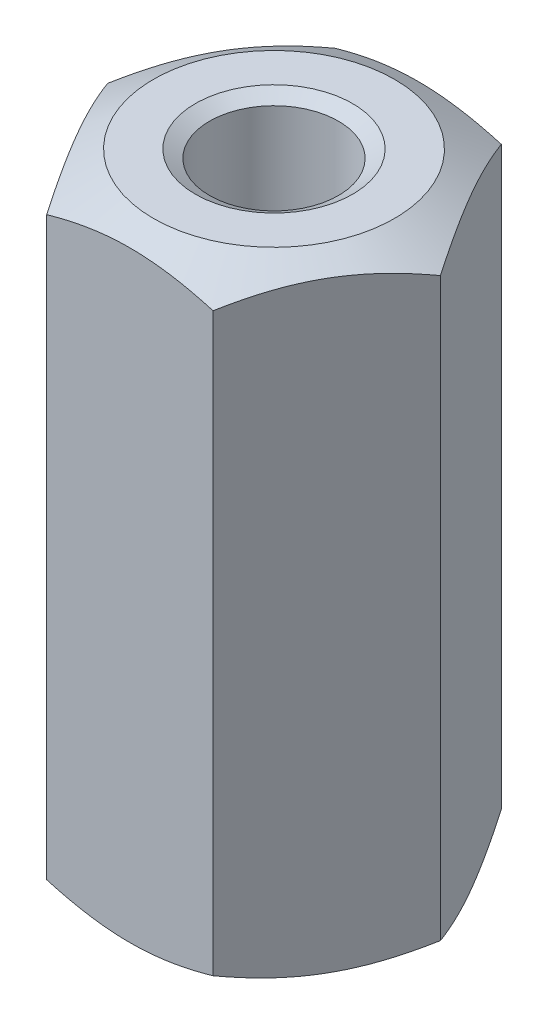
ISO-10303-21;
HEADER;
FILE_DESCRIPTION(('STEP AP214'),'2;1');
FILE_NAME('part.step','',(''),(''),'','','');
FILE_SCHEMA(('AUTOMOTIVE_DESIGN { 1 0 10303 214 1 1 1 1 }'));
ENDSEC;
DATA;
#1=APPLICATION_CONTEXT('core data for automotive mechanical design processes');
#2=APPLICATION_PROTOCOL_DEFINITION('international standard','automotive_design',2000,#1);
#3=PRODUCT_CONTEXT('',#1,'mechanical');
#4=PRODUCT('Part','Part','',(#3));
#5=PRODUCT_RELATED_PRODUCT_CATEGORY('part','',(#4));
#6=PRODUCT_DEFINITION_FORMATION('','',#4);
#7=PRODUCT_DEFINITION_CONTEXT('part definition',#1,'design');
#8=PRODUCT_DEFINITION('design','',#6,#7);
#9=PRODUCT_DEFINITION_SHAPE('','',#8);
#10=(LENGTH_UNIT() NAMED_UNIT(*) SI_UNIT(.MILLI.,.METRE.));
#11=(NAMED_UNIT(*) PLANE_ANGLE_UNIT() SI_UNIT($,.RADIAN.));
#12=(NAMED_UNIT(*) SI_UNIT($,.STERADIAN.) SOLID_ANGLE_UNIT());
#13=UNCERTAINTY_MEASURE_WITH_UNIT(LENGTH_MEASURE(1.E-05),#10,'distance_accuracy_value','');
#14=(GEOMETRIC_REPRESENTATION_CONTEXT(3) GLOBAL_UNCERTAINTY_ASSIGNED_CONTEXT((#13)) GLOBAL_UNIT_ASSIGNED_CONTEXT((#10,
#11,#12)) REPRESENTATION_CONTEXT('',''));
#15=CARTESIAN_POINT('',(0.,0.,0.));
#16=DIRECTION('',(0.,0.,1.));
#17=DIRECTION('',(1.,0.,0.));
#18=AXIS2_PLACEMENT_3D('',#15,#16,#17);
#19=CARTESIAN_POINT('',(0.,6.,0.));
#20=DIRECTION('',(0.,1.,0.));
#21=DIRECTION('',(0.,0.,1.));
#22=AXIS2_PLACEMENT_3D('',#19,#20,#21);
#23=PLANE('',#22);
#24=CARTESIAN_POINT('',(0.,6.,0.));
#25=DIRECTION('',(0.,1.,0.));
#26=DIRECTION('',(0.,0.,1.));
#27=AXIS2_PLACEMENT_3D('',#24,#25,#26);
#28=CIRCLE('',#27,2.3);
#29=CARTESIAN_POINT('',(0.,6.,2.3));
#30=VERTEX_POINT('',#29);
#31=EDGE_CURVE('E228',#30,#30,#28,.T.);
#32=ORIENTED_EDGE('',*,*,#31,.T.);
#33=EDGE_LOOP('',(#32));
#34=FACE_BOUND('',#33,.T.);
#35=CARTESIAN_POINT('',(0.,6.,0.));
#36=DIRECTION('',(0.,1.,0.));
#37=DIRECTION('',(0.,0.,1.));
#38=AXIS2_PLACEMENT_3D('',#35,#36,#37);
#39=CIRCLE('',#38,1.5);
#40=CARTESIAN_POINT('',(0.,6.,1.5));
#41=VERTEX_POINT('',#40);
#42=EDGE_CURVE('E125',#41,#41,#39,.F.);
#43=ORIENTED_EDGE('',*,*,#42,.T.);
#44=EDGE_LOOP('',(#43));
#45=FACE_BOUND('',#44,.T.);
#46=ADVANCED_FACE('F33',(#34,#45),#23,.T.);
#47=CARTESIAN_POINT('',(0.,-6.,0.));
#48=DIRECTION('',(0.,1.,0.));
#49=DIRECTION('',(0.,0.,1.));
#50=AXIS2_PLACEMENT_3D('',#47,#48,#49);
#51=PLANE('',#50);
#52=CARTESIAN_POINT('',(0.,-6.,0.));
#53=DIRECTION('',(0.,1.,0.));
#54=DIRECTION('',(0.,0.,1.));
#55=AXIS2_PLACEMENT_3D('',#52,#53,#54);
#56=CIRCLE('',#55,2.3);
#57=CARTESIAN_POINT('',(0.,-6.,2.3));
#58=VERTEX_POINT('',#57);
#59=EDGE_CURVE('E103',#58,#58,#56,.T.);
#60=ORIENTED_EDGE('',*,*,#59,.F.);
#61=EDGE_LOOP('',(#60));
#62=FACE_BOUND('',#61,.T.);
#63=CARTESIAN_POINT('',(0.,-6.,0.));
#64=DIRECTION('',(0.,1.,0.));
#65=DIRECTION('',(0.,0.,1.));
#66=AXIS2_PLACEMENT_3D('',#63,#64,#65);
#67=CIRCLE('',#66,1.5);
#68=CARTESIAN_POINT('',(0.,-6.,1.5));
#69=VERTEX_POINT('',#68);
#70=EDGE_CURVE('E128',#69,#69,#67,.T.);
#71=ORIENTED_EDGE('',*,*,#70,.T.);
#72=EDGE_LOOP('',(#71));
#73=FACE_BOUND('',#72,.T.);
#74=ADVANCED_FACE('F145',(#62,#73),#51,.F.);
#75=CARTESIAN_POINT('',(1.58771324027147,6.,2.75));
#76=DIRECTION('',(-0.866025403784439,0.,-0.5));
#77=DIRECTION('',(-0.5,0.,0.866025403784439));
#78=AXIS2_PLACEMENT_3D('',#75,#76,#77);
#79=PLANE('',#78);
#80=DIRECTION('',(0.,-1.,0.));
#81=VECTOR('',#80,1.);
#82=CARTESIAN_POINT('',(1.58771324027147,6.,2.75));
#83=LINE('',#82,#81);
#84=CARTESIAN_POINT('',(1.58771324027147,5.49457228580281,2.75));
#85=VERTEX_POINT('',#84);
#86=CARTESIAN_POINT('',(1.58771324027147,-5.49457228580281,2.75));
#87=VERTEX_POINT('',#86);
#88=EDGE_CURVE('E106',#85,#87,#83,.T.);
#89=ORIENTED_EDGE('',*,*,#88,.T.);
#90=CARTESIAN_POINT('',(1.58759777021763,-5.49450561549991,2.7502));
#91=CARTESIAN_POINT('',(1.65737010029699,-5.53480471661541,2.6293507793401));
#92=CARTESIAN_POINT('',(1.72774469983533,-5.57145547626701,2.50745839737737));
#93=CARTESIAN_POINT('',(1.86971254687003,-5.63543019589487,2.26156287327211));
#94=CARTESIAN_POINT('',(1.94130831721583,-5.66273152319017,2.13755536142615));
#95=CARTESIAN_POINT('',(2.08361254889599,-5.70523063357055,1.89107720202406));
#96=CARTESIAN_POINT('',(2.15429911309864,-5.72071126024221,1.76864448141259));
#97=CARTESIAN_POINT('',(2.29600490065923,-5.73919298149473,1.52320285763109));
#98=CARTESIAN_POINT('',(2.36702360884404,-5.74220937940207,1.40019484676709));
#99=CARTESIAN_POINT('',(2.49972966594897,-5.73593923343612,1.17034121338921));
#100=CARTESIAN_POINT('',(2.56143686540073,-5.72819222458797,1.06346120874598));
#101=CARTESIAN_POINT('',(2.68444923614047,-5.70363719780032,0.850397532665253));
#102=CARTESIAN_POINT('',(2.74575398185008,-5.6868207892141,0.744214598351113));
#103=CARTESIAN_POINT('',(2.86902004703207,-5.64478045651872,0.530711510606818));
#104=CARTESIAN_POINT('',(2.93096576264319,-5.61937829817744,0.423418383857146));
#105=CARTESIAN_POINT('',(3.05393320806134,-5.56172515302469,0.210432520715949));
#106=CARTESIAN_POINT('',(3.11495651365995,-5.52948771556569,0.104737054973348));
#107=CARTESIAN_POINT('',(3.17554195059678,-5.49450561549991,-0.000200000000000119));
#108=B_SPLINE_CURVE_WITH_KNOTS('',3,(#90,#91,#92,#93,#94,#95,#96,#97,#98,#99,#100,#101,#102,
#103,#104,#105,#106,#107),.UNSPECIFIED.,.F.,.F.,(4,2,2,2,2,2,2,2,4),(0.,0.435912828725888,
0.872873557116332,1.29901931904672,1.72464171213574,2.09526089052938,2.46622354066375,
2.84541551798558,3.22386274754525),.UNSPECIFIED.);
#109=CARTESIAN_POINT('',(3.17542648054294,-5.49457228580281,0.));
#110=VERTEX_POINT('',#109);
#111=EDGE_CURVE('E53',#87,#110,#108,.T.);
#112=ORIENTED_EDGE('',*,*,#111,.T.);
#113=DIRECTION('',(0.,-1.,0.));
#114=VECTOR('',#113,1.);
#115=CARTESIAN_POINT('',(3.17542648054294,6.,0.));
#116=LINE('',#115,#114);
#117=CARTESIAN_POINT('',(3.17542648054294,5.49457228580281,0.));
#118=VERTEX_POINT('',#117);
#119=EDGE_CURVE('E119',#118,#110,#116,.T.);
#120=ORIENTED_EDGE('',*,*,#119,.F.);
#121=CARTESIAN_POINT('',(3.17554195059678,5.49450561549991,-0.0002));
#122=CARTESIAN_POINT('',(3.10576962051743,5.53480471661541,0.120649220659906));
#123=CARTESIAN_POINT('',(3.03539502097908,5.57145547626701,0.242541602622634));
#124=CARTESIAN_POINT('',(2.89342717394439,5.63543019589487,0.488437126727893));
#125=CARTESIAN_POINT('',(2.82183140359859,5.66273152319017,0.612444638573855));
#126=CARTESIAN_POINT('',(2.67952717191843,5.70523063357055,0.858922797975944));
#127=CARTESIAN_POINT('',(2.60884060771577,5.72071126024221,0.981355518587418));
#128=CARTESIAN_POINT('',(2.46713482015519,5.73919298149473,1.22679714236892));
#129=CARTESIAN_POINT('',(2.39611611197038,5.74220937940207,1.34980515323291));
#130=CARTESIAN_POINT('',(2.26341005486545,5.73593923343612,1.57965878661079));
#131=CARTESIAN_POINT('',(2.20170285541369,5.72819222458797,1.68653879125402));
#132=CARTESIAN_POINT('',(2.07869048467395,5.70363719780032,1.89960246733475));
#133=CARTESIAN_POINT('',(2.01738573896434,5.6868207892141,2.00578540164889));
#134=CARTESIAN_POINT('',(1.89411967378235,5.64478045651871,2.21928848939319));
#135=CARTESIAN_POINT('',(1.83217395817123,5.61937829817744,2.32658161614286));
#136=CARTESIAN_POINT('',(1.70920651275308,5.56172515302469,2.53956747928406));
#137=CARTESIAN_POINT('',(1.64818320715446,5.52948771556569,2.64526294502666));
#138=CARTESIAN_POINT('',(1.58759777021763,5.49450561549991,2.75020000000001));
#139=B_SPLINE_CURVE_WITH_KNOTS('',3,(#121,#122,#123,#124,#125,#126,#127,#128,#129,#130,#131,
#132,#133,#134,#135,#136,#137,#138),.UNSPECIFIED.,.F.,.F.,(4,2,2,2,2,2,2,2,4),(0.,
0.435912828725888,0.872873557116332,1.29901931904671,1.72464171213574,2.09526089052938,
2.46622354066375,2.84541551798558,3.22386274754525),.UNSPECIFIED.);
#140=EDGE_CURVE('E110',#118,#85,#139,.T.);
#141=ORIENTED_EDGE('',*,*,#140,.T.);
#142=EDGE_LOOP('',(#89,#112,#120,#141));
#143=FACE_BOUND('',#142,.T.);
#144=ADVANCED_FACE('F198',(#143),#79,.F.);
#145=CARTESIAN_POINT('',(3.17542648054294,6.,0.));
#146=DIRECTION('',(-0.866025403784439,0.,0.5));
#147=DIRECTION('',(0.5,0.,0.866025403784439));
#148=AXIS2_PLACEMENT_3D('',#145,#146,#147);
#149=PLANE('',#148);
#150=ORIENTED_EDGE('',*,*,#119,.T.);
#151=CARTESIAN_POINT('',(3.17554195059678,-5.49450561549991,0.0002));
#152=CARTESIAN_POINT('',(3.10576962051743,-5.53480471661541,-0.120649220659906));
#153=CARTESIAN_POINT('',(3.03539502097908,-5.57145547626701,-0.242541602622634));
#154=CARTESIAN_POINT('',(2.89342717394439,-5.63543019589487,-0.488437126727893));
#155=CARTESIAN_POINT('',(2.82183140359859,-5.66273152319017,-0.612444638573855));
#156=CARTESIAN_POINT('',(2.67952717191843,-5.70523063357055,-0.858922797975943));
#157=CARTESIAN_POINT('',(2.60884060771577,-5.72071126024221,-0.981355518587417));
#158=CARTESIAN_POINT('',(2.46713482015519,-5.73919298149473,-1.22679714236891));
#159=CARTESIAN_POINT('',(2.39611611197038,-5.74220937940207,-1.34980515323291));
#160=CARTESIAN_POINT('',(2.26341005486545,-5.73593923343612,-1.57965878661079));
#161=CARTESIAN_POINT('',(2.20170285541369,-5.72819222458797,-1.68653879125402));
#162=CARTESIAN_POINT('',(2.07869048467395,-5.70363719780032,-1.89960246733475));
#163=CARTESIAN_POINT('',(2.01738573896434,-5.6868207892141,-2.00578540164889));
#164=CARTESIAN_POINT('',(1.89411967378235,-5.64478045651872,-2.21928848939319));
#165=CARTESIAN_POINT('',(1.83217395817123,-5.61937829817744,-2.32658161614286));
#166=CARTESIAN_POINT('',(1.70920651275307,-5.56172515302469,-2.53956747928406));
#167=CARTESIAN_POINT('',(1.64818320715446,-5.52948771556569,-2.64526294502666));
#168=CARTESIAN_POINT('',(1.58759777021763,-5.49450561549991,-2.75020000000001));
#169=B_SPLINE_CURVE_WITH_KNOTS('',3,(#151,#152,#153,#154,#155,#156,#157,#158,#159,#160,#161,
#162,#163,#164,#165,#166,#167,#168),.UNSPECIFIED.,.F.,.F.,(4,2,2,2,2,2,2,2,4),(0.,
0.435912828725888,0.872873557116331,1.29901931904671,1.72464171213573,2.09526089052938,
2.46622354066375,2.84541551798558,3.22386274754525),.UNSPECIFIED.);
#170=CARTESIAN_POINT('',(1.58771324027147,-5.49457228580281,-2.75000000000001));
#171=VERTEX_POINT('',#170);
#172=EDGE_CURVE('E184',#110,#171,#169,.T.);
#173=ORIENTED_EDGE('',*,*,#172,.T.);
#174=DIRECTION('',(0.,-1.,0.));
#175=VECTOR('',#174,1.);
#176=CARTESIAN_POINT('',(1.58771324027147,6.,-2.75000000000001));
#177=LINE('',#176,#175);
#178=CARTESIAN_POINT('',(1.58771324027147,5.49457228580281,-2.75000000000001));
#179=VERTEX_POINT('',#178);
#180=EDGE_CURVE('E116',#179,#171,#177,.T.);
#181=ORIENTED_EDGE('',*,*,#180,.F.);
#182=CARTESIAN_POINT('',(1.58759777021763,5.49450561549991,-2.75020000000001));
#183=CARTESIAN_POINT('',(1.65737010029698,5.53480471661541,-2.6293507793401));
#184=CARTESIAN_POINT('',(1.72774469983533,5.57145547626701,-2.50745839737737));
#185=CARTESIAN_POINT('',(1.86971254687003,5.63543019589487,-2.26156287327212));
#186=CARTESIAN_POINT('',(1.94130831721583,5.66273152319017,-2.13755536142615));
#187=CARTESIAN_POINT('',(2.08361254889599,5.70523063357055,-1.89107720202406));
#188=CARTESIAN_POINT('',(2.15429911309864,5.72071126024221,-1.76864448141259));
#189=CARTESIAN_POINT('',(2.29600490065923,5.73919298149473,-1.52320285763109));
#190=CARTESIAN_POINT('',(2.36702360884404,5.74220937940207,-1.40019484676709));
#191=CARTESIAN_POINT('',(2.49972966594897,5.73593923343612,-1.17034121338921));
#192=CARTESIAN_POINT('',(2.56143686540073,5.72819222458797,-1.06346120874598));
#193=CARTESIAN_POINT('',(2.68444923614047,5.70363719780032,-0.850397532665255));
#194=CARTESIAN_POINT('',(2.74575398185008,5.6868207892141,-0.744214598351114));
#195=CARTESIAN_POINT('',(2.86902004703206,5.64478045651872,-0.530711510606819));
#196=CARTESIAN_POINT('',(2.93096576264318,5.61937829817744,-0.423418383857147));
#197=CARTESIAN_POINT('',(3.05393320806134,5.56172515302469,-0.21043252071595));
#198=CARTESIAN_POINT('',(3.11495651365995,5.52948771556569,-0.104737054973348));
#199=CARTESIAN_POINT('',(3.17554195059678,5.49450561549991,0.000200000000000366));
#200=B_SPLINE_CURVE_WITH_KNOTS('',3,(#182,#183,#184,#185,#186,#187,#188,#189,#190,#191,#192,
#193,#194,#195,#196,#197,#198,#199),.UNSPECIFIED.,.F.,.F.,(4,2,2,2,2,2,2,2,4),(0.,
0.435912828725888,0.872873557116332,1.29901931904672,1.72464171213574,2.09526089052938,
2.46622354066375,2.84541551798558,3.22386274754525),.UNSPECIFIED.);
#201=EDGE_CURVE('E204',#179,#118,#200,.T.);
#202=ORIENTED_EDGE('',*,*,#201,.T.);
#203=EDGE_LOOP('',(#150,#173,#181,#202));
#204=FACE_BOUND('',#203,.T.);
#205=ADVANCED_FACE('F194',(#204),#149,.F.);
#206=CARTESIAN_POINT('',(1.58771324027147,6.,-2.75000000000001));
#207=DIRECTION('',(0.,0.,1.));
#208=DIRECTION('',(1.,0.,0.));
#209=AXIS2_PLACEMENT_3D('',#206,#207,#208);
#210=PLANE('',#209);
#211=ORIENTED_EDGE('',*,*,#180,.T.);
#212=CARTESIAN_POINT('',(-4.25033145287008,-4.40513196731975,-2.75000000000001));
#213=CARTESIAN_POINT('',(-4.1303291738038,-4.46328552376506,-2.75000000000001));
#214=CARTESIAN_POINT('',(-4.01004983413411,-4.5208772272686,-2.75000000000001));
#215=CARTESIAN_POINT('',(-3.76878961460664,-4.63462059140177,-2.75000000000001));
#216=CARTESIAN_POINT('',(-3.64780862644652,-4.69077202205219,-2.75000000000001));
#217=CARTESIAN_POINT('',(-3.404367529373,-4.80160403782997,-2.75000000000001));
#218=CARTESIAN_POINT('',(-3.28190294431011,-4.85627482539459,-2.75000000000001));
#219=CARTESIAN_POINT('',(-3.03599450358559,-4.96335926689367,-2.75000000000001));
#220=CARTESIAN_POINT('',(-2.91255069498891,-5.01577302853963,-2.75000000000001));
#221=CARTESIAN_POINT('',(-2.6605846037137,-5.1193513424363,-2.75000000000001));
#222=CARTESIAN_POINT('',(-2.53202467246468,-5.17042481380449,-2.75000000000001));
#223=CARTESIAN_POINT('',(-2.27339546600921,-5.26867116627099,-2.75000000000001));
#224=CARTESIAN_POINT('',(-2.14332602255703,-5.31584360771719,-2.75000000000001));
#225=CARTESIAN_POINT('',(-1.88171894843911,-5.4050391275818,-2.75000000000001));
#226=CARTESIAN_POINT('',(-1.75018494943096,-5.44707274978064,-2.75000000000001));
#227=CARTESIAN_POINT('',(-1.4852304480644,-5.52463241022328,-2.75000000000001));
#228=CARTESIAN_POINT('',(-1.35181055870214,-5.56016051292692,-2.75000000000001));
#229=CARTESIAN_POINT('',(-1.08373289928671,-5.62280984757322,-2.75000000000001));
#230=CARTESIAN_POINT('',(-0.949085660894063,-5.64997531046171,-2.75000000000001));
#231=CARTESIAN_POINT('',(-0.678132213705361,-5.69434895075531,-2.75000000000001));
#232=CARTESIAN_POINT('',(-0.541826162212508,-5.71155806491117,-2.75000000000001));
#233=CARTESIAN_POINT('',(-0.270011115145824,-5.73442056514203,-2.75000000000001));
#234=CARTESIAN_POINT('',(-0.134514837331863,-5.74022144417696,-2.75000000000001));
#235=CARTESIAN_POINT('',(0.136486675869692,-5.74016310944683,-2.75000000000001));
#236=CARTESIAN_POINT('',(0.271991911400077,-5.73430358285808,-2.75000000000001));
#237=CARTESIAN_POINT('',(0.502447931814759,-5.71483437708286,-2.75000000000001));
#238=CARTESIAN_POINT('',(0.59764716846729,-5.70399881877358,-2.75000000000001));
#239=CARTESIAN_POINT('',(0.787337154500195,-5.67725486282926,-2.75000000000001));
#240=CARTESIAN_POINT('',(0.881827804189378,-5.66134576461064,-2.75000000000001));
#241=CARTESIAN_POINT('',(1.16410343654589,-5.60684313238953,-2.75000000000001));
#242=CARTESIAN_POINT('',(1.35058572003798,-5.56148442401397,-2.75000000000001));
#243=CARTESIAN_POINT('',(1.72386016772581,-5.4564611932197,-2.75000000000001));
#244=CARTESIAN_POINT('',(1.91056493849209,-5.39649781492414,-2.75000000000001));
#245=CARTESIAN_POINT('',(2.18803356718484,-5.29938949591212,-2.75000000000001));
#246=CARTESIAN_POINT('',(2.28008209529738,-5.26583010693575,-2.75000000000001));
#247=CARTESIAN_POINT('',(2.46342042110948,-5.19670015167589,-2.75000000000001));
#248=CARTESIAN_POINT('',(2.55471022964987,-5.1611296141852,-2.75000000000001));
#249=CARTESIAN_POINT('',(2.77828764635792,-5.07163748345261,-2.75000000000001));
#250=CARTESIAN_POINT('',(2.91019737660956,-5.01677437965595,-2.75000000000001));
#251=CARTESIAN_POINT('',(3.17284123232817,-4.90429439047942,-2.75000000000001));
#252=CARTESIAN_POINT('',(3.30357527655949,-4.84667731652104,-2.75000000000001));
#253=CARTESIAN_POINT('',(3.56409932828483,-4.72927321475112,-2.75000000000001));
#254=CARTESIAN_POINT('',(3.69388910779176,-4.66948568248723,-2.75000000000001));
#255=CARTESIAN_POINT('',(3.95266570876932,-4.54819473219481,-2.75000000000001));
#256=CARTESIAN_POINT('',(4.08165251170503,-4.48669127473627,-2.75000000000001));
#257=CARTESIAN_POINT('',(4.46792337545711,-4.29998738774473,-2.75000000000001));
#258=CARTESIAN_POINT('',(4.72421365009655,-4.17273260780242,-2.75000000000001));
#259=CARTESIAN_POINT('',(5.23491279066496,-3.91461357809641,-2.75000000000001));
#260=CARTESIAN_POINT('',(5.48932191212183,-3.78374983042162,-2.75000000000001));
#261=CARTESIAN_POINT('',(5.97409277590586,-3.53131268558814,-2.75000000000001));
#262=CARTESIAN_POINT('',(6.20456792604645,-3.40995667938019,-2.75000000000001));
#263=CARTESIAN_POINT('',(6.66469522965432,-3.1656744006014,-2.75000000000001));
#264=CARTESIAN_POINT('',(6.89434734917453,-3.0427480641932,-2.75000000000001));
#265=CARTESIAN_POINT('',(7.35240279455849,-2.79603628047209,-2.75000000000001));
#266=CARTESIAN_POINT('',(7.58080781712237,-2.67225397940625,-2.75000000000001));
#267=CARTESIAN_POINT('',(8.03709660862702,-2.42376404922358,-2.75000000000001));
#268=CARTESIAN_POINT('',(8.26498040768308,-2.29905647542944,-2.75000000000001));
#269=CARTESIAN_POINT('',(8.49267485793616,-2.17400656946448,-2.75000000000001));
#270=B_SPLINE_CURVE_WITH_KNOTS('',3,(#212,#213,#214,#215,#216,#217,#218,#219,#220,#221,#222,
#223,#224,#225,#226,#227,#228,#229,#230,#231,#232,#233,#234,#235,#236,#237,#238,#239,#240,#241,
#242,#243,#244,#245,#246,#247,#248,#249,#250,#251,#252,#253,#254,#255,#256,#257,#258,#259,#260,
#261,#262,#263,#264,#265,#266,#267,#268,#269),.UNSPECIFIED.,.F.,.F.,(4,2,2,2,2,2,2,2,2,2,2,2,2,
2,2,2,2,2,2,2,2,2,2,2,2,2,2,2,4),(0.,0.400056768710974,0.800177024764429,1.20249972977339,
1.60480321350908,2.01975477528249,2.43475303918523,2.84888499032283,3.26288529230995,
3.67465670835423,4.08638937626445,4.49276296487265,4.89914745575961,5.18645069268905,
5.47379361929273,6.04879858348343,6.63673824831456,6.93064595029273,7.2245494455757,
7.65309903272825,8.08167800703703,8.51035723643407,8.93904632451984,9.79742793650211,
10.6556907247339,11.4371009977039,12.2185431384355,12.997911172222,13.7772329766735),.UNSPECIFIED.);
#271=CARTESIAN_POINT('',(-1.58771324027147,-5.49457228580281,-2.75000000000001));
#272=VERTEX_POINT('',#271);
#273=EDGE_CURVE('E179',#171,#272,#270,.F.);
#274=ORIENTED_EDGE('',*,*,#273,.T.);
#275=DIRECTION('',(0.,-1.,0.));
#276=VECTOR('',#275,1.);
#277=CARTESIAN_POINT('',(-1.58771324027147,6.,-2.75000000000001));
#278=LINE('',#277,#276);
#279=CARTESIAN_POINT('',(-1.58771324027147,5.49457228580281,-2.75000000000001));
#280=VERTEX_POINT('',#279);
#281=EDGE_CURVE('E108',#280,#272,#278,.T.);
#282=ORIENTED_EDGE('',*,*,#281,.F.);
#283=CARTESIAN_POINT('',(-4.25033145287008,4.40513196731975,-2.75000000000001));
#284=CARTESIAN_POINT('',(-4.1303291738038,4.46328552376505,-2.75000000000001));
#285=CARTESIAN_POINT('',(-4.01004983413411,4.5208772272686,-2.75000000000001));
#286=CARTESIAN_POINT('',(-3.76878961460664,4.63462059140177,-2.75000000000001));
#287=CARTESIAN_POINT('',(-3.64780862644652,4.69077202205218,-2.75000000000001));
#288=CARTESIAN_POINT('',(-3.404367529373,4.80160403782997,-2.75000000000001));
#289=CARTESIAN_POINT('',(-3.28190294431011,4.85627482539459,-2.75000000000001));
#290=CARTESIAN_POINT('',(-3.0359945035856,4.96335926689367,-2.75000000000001));
#291=CARTESIAN_POINT('',(-2.91255069498891,5.01577302853962,-2.75000000000001));
#292=CARTESIAN_POINT('',(-2.6605846037137,5.1193513424363,-2.75000000000001));
#293=CARTESIAN_POINT('',(-2.53202467246468,5.17042481380449,-2.75000000000001));
#294=CARTESIAN_POINT('',(-2.27339546600921,5.26867116627099,-2.75000000000001));
#295=CARTESIAN_POINT('',(-2.14332602255703,5.31584360771719,-2.75000000000001));
#296=CARTESIAN_POINT('',(-1.88171894843911,5.4050391275818,-2.75000000000001));
#297=CARTESIAN_POINT('',(-1.75018494943096,5.44707274978064,-2.75000000000001));
#298=CARTESIAN_POINT('',(-1.4852304480644,5.52463241022328,-2.75000000000001));
#299=CARTESIAN_POINT('',(-1.35181055870214,5.56016051292692,-2.75000000000001));
#300=CARTESIAN_POINT('',(-1.08373289928671,5.62280984757322,-2.75000000000001));
#301=CARTESIAN_POINT('',(-0.949085660894064,5.64997531046171,-2.75000000000001));
#302=CARTESIAN_POINT('',(-0.678132213705362,5.69434895075531,-2.75000000000001));
#303=CARTESIAN_POINT('',(-0.541826162212509,5.71155806491117,-2.75000000000001));
#304=CARTESIAN_POINT('',(-0.270011115145824,5.73442056514203,-2.75000000000001));
#305=CARTESIAN_POINT('',(-0.134514837331863,5.74022144417696,-2.75000000000001));
#306=CARTESIAN_POINT('',(0.136486675869692,5.74016310944683,-2.75000000000001));
#307=CARTESIAN_POINT('',(0.271991911400078,5.73430358285808,-2.75000000000001));
#308=CARTESIAN_POINT('',(0.50244793181476,5.71483437708286,-2.75000000000001));
#309=CARTESIAN_POINT('',(0.597647168467289,5.70399881877358,-2.75000000000001));
#310=CARTESIAN_POINT('',(0.787337154500194,5.67725486282926,-2.75000000000001));
#311=CARTESIAN_POINT('',(0.881827804189377,5.66134576461064,-2.75000000000001));
#312=CARTESIAN_POINT('',(1.16410343654588,5.60684313238953,-2.75000000000001));
#313=CARTESIAN_POINT('',(1.35058572003797,5.56148442401397,-2.75000000000001));
#314=CARTESIAN_POINT('',(1.7238601677258,5.4564611932197,-2.75000000000001));
#315=CARTESIAN_POINT('',(1.91056493849209,5.39649781492414,-2.75000000000001));
#316=CARTESIAN_POINT('',(2.18803356718484,5.29938949591212,-2.75000000000001));
#317=CARTESIAN_POINT('',(2.28008209529738,5.26583010693575,-2.75000000000001));
#318=CARTESIAN_POINT('',(2.46342042110947,5.19670015167589,-2.75000000000001));
#319=CARTESIAN_POINT('',(2.55471022964986,5.1611296141852,-2.75000000000001));
#320=CARTESIAN_POINT('',(2.77828764635792,5.07163748345262,-2.75000000000001));
#321=CARTESIAN_POINT('',(2.91019737660956,5.01677437965595,-2.75000000000001));
#322=CARTESIAN_POINT('',(3.17284123232816,4.90429439047942,-2.75000000000001));
#323=CARTESIAN_POINT('',(3.30357527655948,4.84667731652104,-2.75000000000001));
#324=CARTESIAN_POINT('',(3.56409932828483,4.72927321475112,-2.75000000000001));
#325=CARTESIAN_POINT('',(3.69388910779176,4.66948568248723,-2.75000000000001));
#326=CARTESIAN_POINT('',(3.95266570876932,4.54819473219481,-2.75000000000001));
#327=CARTESIAN_POINT('',(4.08165251170502,4.48669127473627,-2.75000000000001));
#328=CARTESIAN_POINT('',(4.4679233754571,4.29998738774473,-2.75000000000001));
#329=CARTESIAN_POINT('',(4.72421365009655,4.17273260780242,-2.75000000000001));
#330=CARTESIAN_POINT('',(5.23491279066496,3.91461357809641,-2.75000000000001));
#331=CARTESIAN_POINT('',(5.48932191212183,3.78374983042161,-2.75000000000001));
#332=CARTESIAN_POINT('',(5.97409277590585,3.53131268558813,-2.75000000000001));
#333=CARTESIAN_POINT('',(6.20456792604644,3.40995667938019,-2.75000000000001));
#334=CARTESIAN_POINT('',(6.66469522965432,3.16567440060139,-2.75000000000001));
#335=CARTESIAN_POINT('',(6.89434734917452,3.0427480641932,-2.75000000000001));
#336=CARTESIAN_POINT('',(7.35240279455848,2.79603628047208,-2.75000000000001));
#337=CARTESIAN_POINT('',(7.58080781712236,2.67225397940624,-2.75000000000001));
#338=CARTESIAN_POINT('',(8.03709660862702,2.42376404922358,-2.75000000000001));
#339=CARTESIAN_POINT('',(8.26498040768308,2.29905647542943,-2.75000000000001));
#340=CARTESIAN_POINT('',(8.49267485793616,2.17400656946448,-2.75000000000001));
#341=B_SPLINE_CURVE_WITH_KNOTS('',3,(#283,#284,#285,#286,#287,#288,#289,#290,#291,#292,#293,
#294,#295,#296,#297,#298,#299,#300,#301,#302,#303,#304,#305,#306,#307,#308,#309,#310,#311,#312,
#313,#314,#315,#316,#317,#318,#319,#320,#321,#322,#323,#324,#325,#326,#327,#328,#329,#330,#331,
#332,#333,#334,#335,#336,#337,#338,#339,#340),.UNSPECIFIED.,.F.,.F.,(4,2,2,2,2,2,2,2,2,2,2,2,2,
2,2,2,2,2,2,2,2,2,2,2,2,2,2,2,4),(0.,0.400056768710975,0.800177024764431,1.20249972977339,
1.60480321350908,2.01975477528249,2.43475303918524,2.84888499032283,3.26288529230996,
3.67465670835423,4.08638937626445,4.49276296487265,4.89914745575961,5.18645069268906,
5.47379361929273,6.04879858348343,6.63673824831456,6.93064595029273,7.2245494455757,
7.65309903272825,8.08167800703703,8.51035723643407,8.93904632451984,9.79742793650211,
10.6556907247339,11.4371009977039,12.2185431384355,12.997911172222,13.7772329766735),.UNSPECIFIED.);
#342=EDGE_CURVE('E210',#280,#179,#341,.T.);
#343=ORIENTED_EDGE('',*,*,#342,.T.);
#344=EDGE_LOOP('',(#211,#274,#282,#343));
#345=FACE_BOUND('',#344,.T.);
#346=ADVANCED_FACE('F197',(#345),#210,.F.);
#347=CARTESIAN_POINT('',(-1.58771324027147,6.,-2.75000000000001));
#348=DIRECTION('',(0.866025403784439,0.,0.5));
#349=DIRECTION('',(0.5,0.,-0.866025403784439));
#350=AXIS2_PLACEMENT_3D('',#347,#348,#349);
#351=PLANE('',#350);
#352=ORIENTED_EDGE('',*,*,#281,.T.);
#353=CARTESIAN_POINT('',(-1.58759777021763,-5.49450561549991,-2.75020000000001));
#354=CARTESIAN_POINT('',(-1.65737010029699,-5.53480471661541,-2.6293507793401));
#355=CARTESIAN_POINT('',(-1.72774469983533,-5.57145547626701,-2.50745839737737));
#356=CARTESIAN_POINT('',(-1.86971254687003,-5.63543019589487,-2.26156287327211));
#357=CARTESIAN_POINT('',(-1.94130831721583,-5.66273152319017,-2.13755536142615));
#358=CARTESIAN_POINT('',(-2.08361254889599,-5.70523063357055,-1.89107720202406));
#359=CARTESIAN_POINT('',(-2.15429911309864,-5.72071126024221,-1.76864448141259));
#360=CARTESIAN_POINT('',(-2.29600490065923,-5.73919298149473,-1.52320285763109));
#361=CARTESIAN_POINT('',(-2.36702360884404,-5.74220937940207,-1.40019484676709));
#362=CARTESIAN_POINT('',(-2.49972966594897,-5.73593923343612,-1.17034121338921));
#363=CARTESIAN_POINT('',(-2.56143686540073,-5.72819222458797,-1.06346120874598));
#364=CARTESIAN_POINT('',(-2.68444923614047,-5.70363719780032,-0.850397532665254));
#365=CARTESIAN_POINT('',(-2.74575398185008,-5.6868207892141,-0.744214598351114));
#366=CARTESIAN_POINT('',(-2.86902004703207,-5.64478045651871,-0.530711510606818));
#367=CARTESIAN_POINT('',(-2.93096576264319,-5.61937829817744,-0.423418383857146));
#368=CARTESIAN_POINT('',(-3.05393320806134,-5.56172515302469,-0.210432520715949));
#369=CARTESIAN_POINT('',(-3.11495651365995,-5.52948771556569,-0.104737054973347));
#370=CARTESIAN_POINT('',(-3.17554195059678,-5.49450561549991,0.000200000000000287));
#371=B_SPLINE_CURVE_WITH_KNOTS('',3,(#353,#354,#355,#356,#357,#358,#359,#360,#361,#362,#363,
#364,#365,#366,#367,#368,#369,#370),.UNSPECIFIED.,.F.,.F.,(4,2,2,2,2,2,2,2,4),(0.,
0.435912828725889,0.872873557116333,1.29901931904672,1.72464171213574,2.09526089052938,
2.46622354066375,2.84541551798558,3.22386274754525),.UNSPECIFIED.);
#372=CARTESIAN_POINT('',(-3.17542648054295,-5.49457228580281,0.));
#373=VERTEX_POINT('',#372);
#374=EDGE_CURVE('E102',#272,#373,#371,.T.);
#375=ORIENTED_EDGE('',*,*,#374,.T.);
#376=DIRECTION('',(0.,-1.,0.));
#377=VECTOR('',#376,1.);
#378=CARTESIAN_POINT('',(-3.17542648054295,6.,0.));
#379=LINE('',#378,#377);
#380=CARTESIAN_POINT('',(-3.17542648054295,5.49457228580281,0.));
#381=VERTEX_POINT('',#380);
#382=EDGE_CURVE('E101',#381,#373,#379,.T.);
#383=ORIENTED_EDGE('',*,*,#382,.F.);
#384=CARTESIAN_POINT('',(-3.17554195059678,5.49450561549991,0.0002));
#385=CARTESIAN_POINT('',(-3.10576962051743,5.53480471661541,-0.120649220659906));
#386=CARTESIAN_POINT('',(-3.03539502097908,5.57145547626701,-0.242541602622634));
#387=CARTESIAN_POINT('',(-2.89342717394439,5.63543019589487,-0.488437126727893));
#388=CARTESIAN_POINT('',(-2.82183140359859,5.66273152319017,-0.612444638573856));
#389=CARTESIAN_POINT('',(-2.67952717191843,5.70523063357055,-0.858922797975944));
#390=CARTESIAN_POINT('',(-2.60884060771578,5.72071126024221,-0.981355518587418));
#391=CARTESIAN_POINT('',(-2.46713482015519,5.73919298149473,-1.22679714236892));
#392=CARTESIAN_POINT('',(-2.39611611197038,5.74220937940207,-1.34980515323291));
#393=CARTESIAN_POINT('',(-2.26341005486545,5.73593923343612,-1.57965878661079));
#394=CARTESIAN_POINT('',(-2.20170285541369,5.72819222458797,-1.68653879125402));
#395=CARTESIAN_POINT('',(-2.07869048467395,5.70363719780031,-1.89960246733475));
#396=CARTESIAN_POINT('',(-2.01738573896434,5.6868207892141,-2.00578540164889));
#397=CARTESIAN_POINT('',(-1.89411967378235,5.64478045651871,-2.21928848939319));
#398=CARTESIAN_POINT('',(-1.83217395817123,5.61937829817744,-2.32658161614286));
#399=CARTESIAN_POINT('',(-1.70920651275308,5.56172515302469,-2.53956747928406));
#400=CARTESIAN_POINT('',(-1.64818320715446,5.52948771556569,-2.64526294502666));
#401=CARTESIAN_POINT('',(-1.58759777021763,5.49450561549991,-2.75020000000001));
#402=B_SPLINE_CURVE_WITH_KNOTS('',3,(#384,#385,#386,#387,#388,#389,#390,#391,#392,#393,#394,
#395,#396,#397,#398,#399,#400,#401),.UNSPECIFIED.,.F.,.F.,(4,2,2,2,2,2,2,2,4),(0.,
0.435912828725888,0.872873557116332,1.29901931904672,1.72464171213574,2.09526089052938,
2.46622354066375,2.84541551798558,3.22386274754525),.UNSPECIFIED.);
#403=EDGE_CURVE('E226',#381,#280,#402,.T.);
#404=ORIENTED_EDGE('',*,*,#403,.T.);
#405=EDGE_LOOP('',(#352,#375,#383,#404));
#406=FACE_BOUND('',#405,.T.);
#407=ADVANCED_FACE('F151',(#406),#351,.F.);
#408=CARTESIAN_POINT('',(-3.17542648054295,6.,0.));
#409=DIRECTION('',(0.866025403784438,0.,-0.5));
#410=DIRECTION('',(-0.5,0.,-0.866025403784439));
#411=AXIS2_PLACEMENT_3D('',#408,#409,#410);
#412=PLANE('',#411);
#413=ORIENTED_EDGE('',*,*,#382,.T.);
#414=CARTESIAN_POINT('',(-3.17554195059678,-5.49450561549991,-0.00020000000000014));
#415=CARTESIAN_POINT('',(-3.10576962051743,-5.53480471661541,0.120649220659906));
#416=CARTESIAN_POINT('',(-3.03539502097908,-5.57145547626701,0.242541602622634));
#417=CARTESIAN_POINT('',(-2.89342717394439,-5.63543019589487,0.488437126727893));
#418=CARTESIAN_POINT('',(-2.82183140359859,-5.66273152319017,0.612444638573855));
#419=CARTESIAN_POINT('',(-2.67952717191843,-5.70523063357055,0.858922797975944));
#420=CARTESIAN_POINT('',(-2.60884060771578,-5.72071126024221,0.981355518587417));
#421=CARTESIAN_POINT('',(-2.46713482015519,-5.73919298149473,1.22679714236892));
#422=CARTESIAN_POINT('',(-2.39611611197038,-5.74220937940207,1.34980515323291));
#423=CARTESIAN_POINT('',(-2.26341005486545,-5.73593923343612,1.57965878661079));
#424=CARTESIAN_POINT('',(-2.20170285541369,-5.72819222458797,1.68653879125402));
#425=CARTESIAN_POINT('',(-2.07869048467395,-5.70363719780032,1.89960246733475));
#426=CARTESIAN_POINT('',(-2.01738573896434,-5.6868207892141,2.00578540164889));
#427=CARTESIAN_POINT('',(-1.89411967378235,-5.64478045651872,2.21928848939319));
#428=CARTESIAN_POINT('',(-1.83217395817123,-5.61937829817744,2.32658161614286));
#429=CARTESIAN_POINT('',(-1.70920651275308,-5.56172515302469,2.53956747928406));
#430=CARTESIAN_POINT('',(-1.64818320715446,-5.52948771556569,2.64526294502666));
#431=CARTESIAN_POINT('',(-1.58759777021763,-5.49450561549991,2.7502));
#432=B_SPLINE_CURVE_WITH_KNOTS('',3,(#414,#415,#416,#417,#418,#419,#420,#421,#422,#423,#424,
#425,#426,#427,#428,#429,#430,#431),.UNSPECIFIED.,.F.,.F.,(4,2,2,2,2,2,2,2,4),(0.,
0.435912828725888,0.872873557116332,1.29901931904672,1.72464171213574,2.09526089052938,
2.46622354066375,2.84541551798558,3.22386274754525),.UNSPECIFIED.);
#433=CARTESIAN_POINT('',(-1.58771324027203,-5.49457228580318,2.75));
#434=VERTEX_POINT('',#433);
#435=EDGE_CURVE('E89',#373,#434,#432,.T.);
#436=ORIENTED_EDGE('',*,*,#435,.T.);
#437=DIRECTION('',(0.,-1.,0.));
#438=VECTOR('',#437,1.);
#439=CARTESIAN_POINT('',(-1.58771324027147,6.,2.75));
#440=LINE('',#439,#438);
#441=CARTESIAN_POINT('',(-1.58771324027147,5.49457228580281,2.75));
#442=VERTEX_POINT('',#441);
#443=EDGE_CURVE('E99',#442,#434,#440,.T.);
#444=ORIENTED_EDGE('',*,*,#443,.F.);
#445=CARTESIAN_POINT('',(-1.58759777021763,5.49450561549991,2.7502));
#446=CARTESIAN_POINT('',(-1.65737010029699,5.53480471661541,2.6293507793401));
#447=CARTESIAN_POINT('',(-1.72774469983533,5.57145547626701,2.50745839737737));
#448=CARTESIAN_POINT('',(-1.86971254687003,5.63543019589487,2.26156287327211));
#449=CARTESIAN_POINT('',(-1.94130831721583,5.66273152319017,2.13755536142615));
#450=CARTESIAN_POINT('',(-2.08361254889599,5.70523063357055,1.89107720202406));
#451=CARTESIAN_POINT('',(-2.15429911309864,5.72071126024221,1.76864448141259));
#452=CARTESIAN_POINT('',(-2.29600490065923,5.73919298149473,1.52320285763109));
#453=CARTESIAN_POINT('',(-2.36702360884404,5.74220937940207,1.40019484676709));
#454=CARTESIAN_POINT('',(-2.49972966594897,5.73593923343612,1.17034121338921));
#455=CARTESIAN_POINT('',(-2.56143686540073,5.72819222458797,1.06346120874598));
#456=CARTESIAN_POINT('',(-2.68444923614047,5.70363719780032,0.850397532665253));
#457=CARTESIAN_POINT('',(-2.74575398185008,5.6868207892141,0.744214598351114));
#458=CARTESIAN_POINT('',(-2.86902004703207,5.64478045651871,0.530711510606818));
#459=CARTESIAN_POINT('',(-2.93096576264319,5.61937829817744,0.423418383857147));
#460=CARTESIAN_POINT('',(-3.05393320806134,5.56172515302469,0.21043252071595));
#461=CARTESIAN_POINT('',(-3.11495651365996,5.52948771556569,0.104737054973348));
#462=CARTESIAN_POINT('',(-3.17554195059678,5.49450561549991,-0.000199999999999843));
#463=B_SPLINE_CURVE_WITH_KNOTS('',3,(#445,#446,#447,#448,#449,#450,#451,#452,#453,#454,#455,
#456,#457,#458,#459,#460,#461,#462),.UNSPECIFIED.,.F.,.F.,(4,2,2,2,2,2,2,2,4),(0.,
0.435912828725888,0.872873557116332,1.29901931904672,1.72464171213574,2.09526089052938,
2.46622354066375,2.84541551798558,3.22386274754525),.UNSPECIFIED.);
#464=EDGE_CURVE('E60',#442,#381,#463,.T.);
#465=ORIENTED_EDGE('',*,*,#464,.T.);
#466=EDGE_LOOP('',(#413,#436,#444,#465));
#467=FACE_BOUND('',#466,.T.);
#468=ADVANCED_FACE('F98',(#467),#412,.F.);
#469=CARTESIAN_POINT('',(-1.58771324027147,6.,2.75));
#470=DIRECTION('',(0.,0.,-1.));
#471=DIRECTION('',(-1.,0.,0.));
#472=AXIS2_PLACEMENT_3D('',#469,#470,#471);
#473=PLANE('',#472);
#474=ORIENTED_EDGE('',*,*,#443,.T.);
#475=CARTESIAN_POINT('',(-4.25033145287008,-4.40513196731975,2.75));
#476=CARTESIAN_POINT('',(-4.1303291738038,-4.46328552376506,2.75));
#477=CARTESIAN_POINT('',(-4.0100498341341,-4.5208772272686,2.75));
#478=CARTESIAN_POINT('',(-3.76878961460664,-4.63462059140178,2.75));
#479=CARTESIAN_POINT('',(-3.64780862644651,-4.69077202205219,2.75));
#480=CARTESIAN_POINT('',(-3.404367529373,-4.80160403782998,2.75));
#481=CARTESIAN_POINT('',(-3.2819029443101,-4.85627482539459,2.75));
#482=CARTESIAN_POINT('',(-3.03599450358559,-4.96335926689368,2.75));
#483=CARTESIAN_POINT('',(-2.9125506949889,-5.01577302853963,2.75));
#484=CARTESIAN_POINT('',(-2.6605846037137,-5.1193513424363,2.75));
#485=CARTESIAN_POINT('',(-2.53202467246468,-5.17042481380449,2.75));
#486=CARTESIAN_POINT('',(-2.27339546600921,-5.26867116627099,2.75));
#487=CARTESIAN_POINT('',(-2.14332602255703,-5.3158436077172,2.75));
#488=CARTESIAN_POINT('',(-1.88171894843911,-5.4050391275818,2.75));
#489=CARTESIAN_POINT('',(-1.75018494943096,-5.44707274978064,2.75));
#490=CARTESIAN_POINT('',(-1.4852304480644,-5.52463241022328,2.75));
#491=CARTESIAN_POINT('',(-1.35181055870214,-5.56016051292692,2.75));
#492=CARTESIAN_POINT('',(-1.08373289928671,-5.62280984757322,2.75));
#493=CARTESIAN_POINT('',(-0.949085660894064,-5.64997531046171,2.75));
#494=CARTESIAN_POINT('',(-0.678132213705362,-5.69434895075531,2.75));
#495=CARTESIAN_POINT('',(-0.541826162212509,-5.71155806491117,2.75));
#496=CARTESIAN_POINT('',(-0.270011115145825,-5.73442056514203,2.75));
#497=CARTESIAN_POINT('',(-0.134514837331864,-5.74022144417697,2.75));
#498=CARTESIAN_POINT('',(0.13648667586969,-5.74016310944683,2.75));
#499=CARTESIAN_POINT('',(0.271991911400075,-5.73430358285809,2.75));
#500=CARTESIAN_POINT('',(0.502447931814758,-5.71483437708286,2.75));
#501=CARTESIAN_POINT('',(0.597647168467288,-5.70399881877358,2.75));
#502=CARTESIAN_POINT('',(0.787337154500192,-5.67725486282926,2.75));
#503=CARTESIAN_POINT('',(0.881827804189375,-5.66134576461065,2.75));
#504=CARTESIAN_POINT('',(1.16410343654588,-5.60684313238953,2.75));
#505=CARTESIAN_POINT('',(1.35058572003797,-5.56148442401398,2.75));
#506=CARTESIAN_POINT('',(1.7238601677258,-5.4564611932197,2.75));
#507=CARTESIAN_POINT('',(1.91056493849209,-5.39649781492414,2.75));
#508=CARTESIAN_POINT('',(2.18803356718484,-5.29938949591212,2.75));
#509=CARTESIAN_POINT('',(2.28008209529738,-5.26583010693576,2.75));
#510=CARTESIAN_POINT('',(2.46342042110947,-5.19670015167589,2.75));
#511=CARTESIAN_POINT('',(2.55471022964986,-5.1611296141852,2.75));
#512=CARTESIAN_POINT('',(2.77828764635792,-5.07163748345262,2.75));
#513=CARTESIAN_POINT('',(2.91019737660956,-5.01677437965595,2.75));
#514=CARTESIAN_POINT('',(3.17284123232817,-4.90429439047943,2.75));
#515=CARTESIAN_POINT('',(3.30357527655948,-4.84667731652104,2.75));
#516=CARTESIAN_POINT('',(3.56409932828483,-4.72927321475112,2.75));
#517=CARTESIAN_POINT('',(3.69388910779176,-4.66948568248723,2.75));
#518=CARTESIAN_POINT('',(3.95266570876932,-4.54819473219481,2.75));
#519=CARTESIAN_POINT('',(4.08165251170503,-4.48669127473627,2.75));
#520=CARTESIAN_POINT('',(4.46792337545711,-4.29998738774473,2.75));
#521=CARTESIAN_POINT('',(4.72421365009655,-4.17273260780243,2.75));
#522=CARTESIAN_POINT('',(5.23491279066496,-3.91461357809641,2.75));
#523=CARTESIAN_POINT('',(5.48932191212183,-3.78374983042162,2.75));
#524=CARTESIAN_POINT('',(5.97409277590586,-3.53131268558814,2.75));
#525=CARTESIAN_POINT('',(6.20456792604645,-3.40995667938019,2.75));
#526=CARTESIAN_POINT('',(6.66469522965432,-3.1656744006014,2.75));
#527=CARTESIAN_POINT('',(6.89434734917453,-3.0427480641932,2.75));
#528=CARTESIAN_POINT('',(7.35240279455849,-2.79603628047208,2.75));
#529=CARTESIAN_POINT('',(7.58080781712237,-2.67225397940625,2.75));
#530=CARTESIAN_POINT('',(8.03709660862702,-2.42376404922358,2.75));
#531=CARTESIAN_POINT('',(8.26498040768308,-2.29905647542944,2.75));
#532=CARTESIAN_POINT('',(8.49267485793616,-2.17400656946448,2.75));
#533=B_SPLINE_CURVE_WITH_KNOTS('',3,(#475,#476,#477,#478,#479,#480,#481,#482,#483,#484,#485,
#486,#487,#488,#489,#490,#491,#492,#493,#494,#495,#496,#497,#498,#499,#500,#501,#502,#503,#504,
#505,#506,#507,#508,#509,#510,#511,#512,#513,#514,#515,#516,#517,#518,#519,#520,#521,#522,#523,
#524,#525,#526,#527,#528,#529,#530,#531,#532),.UNSPECIFIED.,.F.,.F.,(4,2,2,2,2,2,2,2,2,2,2,2,2,
2,2,2,2,2,2,2,2,2,2,2,2,2,2,2,4),(0.,0.400056768710974,0.800177024764429,1.20249972977339,
1.60480321350907,2.01975477528249,2.43475303918523,2.84888499032283,3.26288529230995,
3.67465670835422,4.08638937626444,4.49276296487264,4.89914745575961,5.18645069268905,
5.47379361929273,6.04879858348343,6.63673824831455,6.93064595029272,7.22454944557569,
7.65309903272824,8.08167800703702,8.51035723643406,8.93904632451984,9.7974279365021,
10.6556907247339,11.4371009977039,12.2185431384355,12.997911172222,13.7772329766735),.UNSPECIFIED.);
#534=EDGE_CURVE('E11',#434,#87,#533,.T.);
#535=ORIENTED_EDGE('',*,*,#534,.T.);
#536=ORIENTED_EDGE('',*,*,#88,.F.);
#537=CARTESIAN_POINT('',(-4.25033145287008,4.40513196731975,2.75));
#538=CARTESIAN_POINT('',(-4.1303291738038,4.46328552376505,2.75));
#539=CARTESIAN_POINT('',(-4.0100498341341,4.5208772272686,2.75));
#540=CARTESIAN_POINT('',(-3.76878961460664,4.63462059140177,2.75));
#541=CARTESIAN_POINT('',(-3.64780862644651,4.69077202205219,2.75));
#542=CARTESIAN_POINT('',(-3.404367529373,4.80160403782997,2.75));
#543=CARTESIAN_POINT('',(-3.2819029443101,4.85627482539459,2.75));
#544=CARTESIAN_POINT('',(-3.03599450358559,4.96335926689367,2.75));
#545=CARTESIAN_POINT('',(-2.9125506949889,5.01577302853963,2.75));
#546=CARTESIAN_POINT('',(-2.6605846037137,5.1193513424363,2.75));
#547=CARTESIAN_POINT('',(-2.53202467246467,5.17042481380449,2.75));
#548=CARTESIAN_POINT('',(-2.27339546600921,5.26867116627099,2.75));
#549=CARTESIAN_POINT('',(-2.14332602255703,5.3158436077172,2.75));
#550=CARTESIAN_POINT('',(-1.88171894843911,5.4050391275818,2.75));
#551=CARTESIAN_POINT('',(-1.75018494943096,5.44707274978064,2.75));
#552=CARTESIAN_POINT('',(-1.4852304480644,5.52463241022328,2.75));
#553=CARTESIAN_POINT('',(-1.35181055870214,5.56016051292692,2.75));
#554=CARTESIAN_POINT('',(-1.08373289928671,5.62280984757322,2.75));
#555=CARTESIAN_POINT('',(-0.949085660894065,5.64997531046171,2.75));
#556=CARTESIAN_POINT('',(-0.678132213705363,5.69434895075531,2.75));
#557=CARTESIAN_POINT('',(-0.54182616221251,5.71155806491117,2.75));
#558=CARTESIAN_POINT('',(-0.270011115145826,5.73442056514203,2.75));
#559=CARTESIAN_POINT('',(-0.134514837331864,5.74022144417697,2.75));
#560=CARTESIAN_POINT('',(0.13648667586969,5.74016310944683,2.75));
#561=CARTESIAN_POINT('',(0.271991911400076,5.73430358285808,2.75));
#562=CARTESIAN_POINT('',(0.502447931814758,5.71483437708286,2.75));
#563=CARTESIAN_POINT('',(0.597647168467287,5.70399881877358,2.75));
#564=CARTESIAN_POINT('',(0.787337154500191,5.67725486282926,2.75));
#565=CARTESIAN_POINT('',(0.881827804189374,5.66134576461064,2.75));
#566=CARTESIAN_POINT('',(1.16410343654588,5.60684313238953,2.75));
#567=CARTESIAN_POINT('',(1.35058572003797,5.56148442401398,2.75));
#568=CARTESIAN_POINT('',(1.7238601677258,5.4564611932197,2.75));
#569=CARTESIAN_POINT('',(1.91056493849208,5.39649781492414,2.75));
#570=CARTESIAN_POINT('',(2.18803356718484,5.29938949591212,2.75));
#571=CARTESIAN_POINT('',(2.28008209529737,5.26583010693576,2.75));
#572=CARTESIAN_POINT('',(2.46342042110947,5.19670015167589,2.75));
#573=CARTESIAN_POINT('',(2.55471022964986,5.1611296141852,2.75));
#574=CARTESIAN_POINT('',(2.77828764635791,5.07163748345262,2.75));
#575=CARTESIAN_POINT('',(2.91019737660955,5.01677437965595,2.75));
#576=CARTESIAN_POINT('',(3.17284123232816,4.90429439047943,2.75));
#577=CARTESIAN_POINT('',(3.30357527655948,4.84667731652104,2.75));
#578=CARTESIAN_POINT('',(3.56409932828482,4.72927321475112,2.75));
#579=CARTESIAN_POINT('',(3.69388910779175,4.66948568248723,2.75));
#580=CARTESIAN_POINT('',(3.95266570876931,4.54819473219481,2.75));
#581=CARTESIAN_POINT('',(4.08165251170502,4.48669127473627,2.75));
#582=CARTESIAN_POINT('',(4.4679233754571,4.29998738774473,2.75));
#583=CARTESIAN_POINT('',(4.72421365009654,4.17273260780243,2.75));
#584=CARTESIAN_POINT('',(5.23491279066496,3.91461357809641,2.75));
#585=CARTESIAN_POINT('',(5.48932191212183,3.78374983042162,2.75));
#586=CARTESIAN_POINT('',(5.97409277590585,3.53131268558814,2.75));
#587=CARTESIAN_POINT('',(6.20456792604644,3.40995667938019,2.75));
#588=CARTESIAN_POINT('',(6.66469522965432,3.16567440060139,2.75));
#589=CARTESIAN_POINT('',(6.89434734917452,3.0427480641932,2.75));
#590=CARTESIAN_POINT('',(7.35240279455848,2.79603628047208,2.75));
#591=CARTESIAN_POINT('',(7.58080781712236,2.67225397940624,2.75));
#592=CARTESIAN_POINT('',(8.03709660862702,2.42376404922358,2.75));
#593=CARTESIAN_POINT('',(8.26498040768308,2.29905647542943,2.75));
#594=CARTESIAN_POINT('',(8.49267485793615,2.17400656946448,2.75));
#595=B_SPLINE_CURVE_WITH_KNOTS('',3,(#537,#538,#539,#540,#541,#542,#543,#544,#545,#546,#547,
#548,#549,#550,#551,#552,#553,#554,#555,#556,#557,#558,#559,#560,#561,#562,#563,#564,#565,#566,
#567,#568,#569,#570,#571,#572,#573,#574,#575,#576,#577,#578,#579,#580,#581,#582,#583,#584,#585,
#586,#587,#588,#589,#590,#591,#592,#593,#594),.UNSPECIFIED.,.F.,.F.,(4,2,2,2,2,2,2,2,2,2,2,2,2,
2,2,2,2,2,2,2,2,2,2,2,2,2,2,2,4),(0.,0.400056768710974,0.80017702476443,1.20249972977339,
1.60480321350908,2.01975477528249,2.43475303918523,2.84888499032283,3.26288529230995,
3.67465670835422,4.08638937626444,4.49276296487264,4.89914745575961,5.18645069268905,
5.47379361929273,6.04879858348342,6.63673824831455,6.93064595029272,7.22454944557568,
7.65309903272824,8.08167800703702,8.51035723643405,8.93904632451983,9.79742793650209,
10.6556907247339,11.4371009977039,12.2185431384355,12.997911172222,13.7772329766735),.UNSPECIFIED.);
#596=EDGE_CURVE('E46',#85,#442,#595,.F.);
#597=ORIENTED_EDGE('',*,*,#596,.T.);
#598=EDGE_LOOP('',(#474,#535,#536,#597));
#599=FACE_BOUND('',#598,.T.);
#600=ADVANCED_FACE('F105',(#599),#473,.F.);
#601=CARTESIAN_POINT('',(0.,6.,0.));
#602=DIRECTION('',(0.,-1.,0.));
#603=DIRECTION('',(0.,0.,-1.));
#604=AXIS2_PLACEMENT_3D('',#601,#602,#603);
#605=CYLINDRICAL_SURFACE('',#604,1.23);
#606=CARTESIAN_POINT('',(0.,-5.8441154273188,0.));
#607=DIRECTION('',(0.,1.,0.));
#608=DIRECTION('',(0.,0.,1.));
#609=AXIS2_PLACEMENT_3D('',#606,#607,#608);
#610=CIRCLE('',#609,1.23);
#611=CARTESIAN_POINT('',(0.,-5.8441154273188,1.23));
#612=VERTEX_POINT('',#611);
#613=EDGE_CURVE('E131',#612,#612,#610,.F.);
#614=ORIENTED_EDGE('',*,*,#613,.T.);
#615=EDGE_LOOP('',(#614));
#616=FACE_BOUND('',#615,.T.);
#617=CARTESIAN_POINT('',(0.,5.8441154273188,0.));
#618=DIRECTION('',(0.,1.,0.));
#619=DIRECTION('',(0.,0.,1.));
#620=AXIS2_PLACEMENT_3D('',#617,#618,#619);
#621=CIRCLE('',#620,1.23);
#622=CARTESIAN_POINT('',(0.,5.8441154273188,1.23));
#623=VERTEX_POINT('',#622);
#624=EDGE_CURVE('E122',#623,#623,#621,.T.);
#625=ORIENTED_EDGE('',*,*,#624,.T.);
#626=EDGE_LOOP('',(#625));
#627=FACE_BOUND('',#626,.T.);
#628=ADVANCED_FACE('F144',(#616,#627),#605,.F.);
#629=CARTESIAN_POINT('',(0.,5.8441154273188,0.));
#630=DIRECTION('',(0.,1.,0.));
#631=DIRECTION('',(0.,0.,1.));
#632=AXIS2_PLACEMENT_3D('',#629,#630,#631);
#633=CONICAL_SURFACE('',#632,1.23,1.0471975511966);
#634=ORIENTED_EDGE('',*,*,#42,.F.);
#635=EDGE_LOOP('',(#634));
#636=FACE_BOUND('',#635,.T.);
#637=ORIENTED_EDGE('',*,*,#624,.F.);
#638=EDGE_LOOP('',(#637));
#639=FACE_BOUND('',#638,.T.);
#640=ADVANCED_FACE('F241',(#636,#639),#633,.F.);
#641=CARTESIAN_POINT('',(0.,-6.,0.));
#642=DIRECTION('',(0.,-1.,0.));
#643=DIRECTION('',(0.,0.,-1.));
#644=AXIS2_PLACEMENT_3D('',#641,#642,#643);
#645=CONICAL_SURFACE('',#644,1.5,1.0471975511966);
#646=ORIENTED_EDGE('',*,*,#613,.F.);
#647=EDGE_LOOP('',(#646));
#648=FACE_BOUND('',#647,.T.);
#649=ORIENTED_EDGE('',*,*,#70,.F.);
#650=EDGE_LOOP('',(#649));
#651=FACE_BOUND('',#650,.T.);
#652=ADVANCED_FACE('F35',(#648,#651),#645,.F.);
#653=CARTESIAN_POINT('',(0.,4.95103114891697,0.));
#654=DIRECTION('',(0.,-1.,0.));
#655=DIRECTION('',(0.,0.,-1.));
#656=AXIS2_PLACEMENT_3D('',#653,#654,#655);
#657=CONICAL_SURFACE('',#656,4.11686734563299,1.0471975511966);
#658=ORIENTED_EDGE('',*,*,#31,.F.);
#659=EDGE_LOOP('',(#658));
#660=FACE_BOUND('',#659,.T.);
#661=ORIENTED_EDGE('',*,*,#201,.F.);
#662=ORIENTED_EDGE('',*,*,#342,.F.);
#663=ORIENTED_EDGE('',*,*,#403,.F.);
#664=ORIENTED_EDGE('',*,*,#464,.F.);
#665=ORIENTED_EDGE('',*,*,#596,.F.);
#666=ORIENTED_EDGE('',*,*,#140,.F.);
#667=EDGE_LOOP('',(#661,#662,#663,#664,#665,#666));
#668=FACE_BOUND('',#667,.T.);
#669=ADVANCED_FACE('F137',(#660,#668),#657,.T.);
#670=CARTESIAN_POINT('',(0.,-6.,0.));
#671=DIRECTION('',(0.,1.,0.));
#672=DIRECTION('',(0.,0.,1.));
#673=AXIS2_PLACEMENT_3D('',#670,#671,#672);
#674=CONICAL_SURFACE('',#673,2.3,1.0471975511966);
#675=ORIENTED_EDGE('',*,*,#59,.T.);
#676=EDGE_LOOP('',(#675));
#677=FACE_BOUND('',#676,.T.);
#678=ORIENTED_EDGE('',*,*,#534,.F.);
#679=ORIENTED_EDGE('',*,*,#435,.F.);
#680=ORIENTED_EDGE('',*,*,#374,.F.);
#681=ORIENTED_EDGE('',*,*,#273,.F.);
#682=ORIENTED_EDGE('',*,*,#172,.F.);
#683=ORIENTED_EDGE('',*,*,#111,.F.);
#684=EDGE_LOOP('',(#678,#679,#680,#681,#682,#683));
#685=FACE_BOUND('',#684,.T.);
#686=ADVANCED_FACE('F88',(#677,#685),#674,.T.);
#687=CLOSED_SHELL('',(#46,#74,#144,#205,#346,#407,#468,#600,#628,#640,#652,#669,#686));
#688=MANIFOLD_SOLID_BREP('B2',#687);
#689=ADVANCED_BREP_SHAPE_REPRESENTATION('',(#18,#688),#14);
#690=SHAPE_DEFINITION_REPRESENTATION(#9,#689);
ENDSEC;
END-ISO-10303-21;
